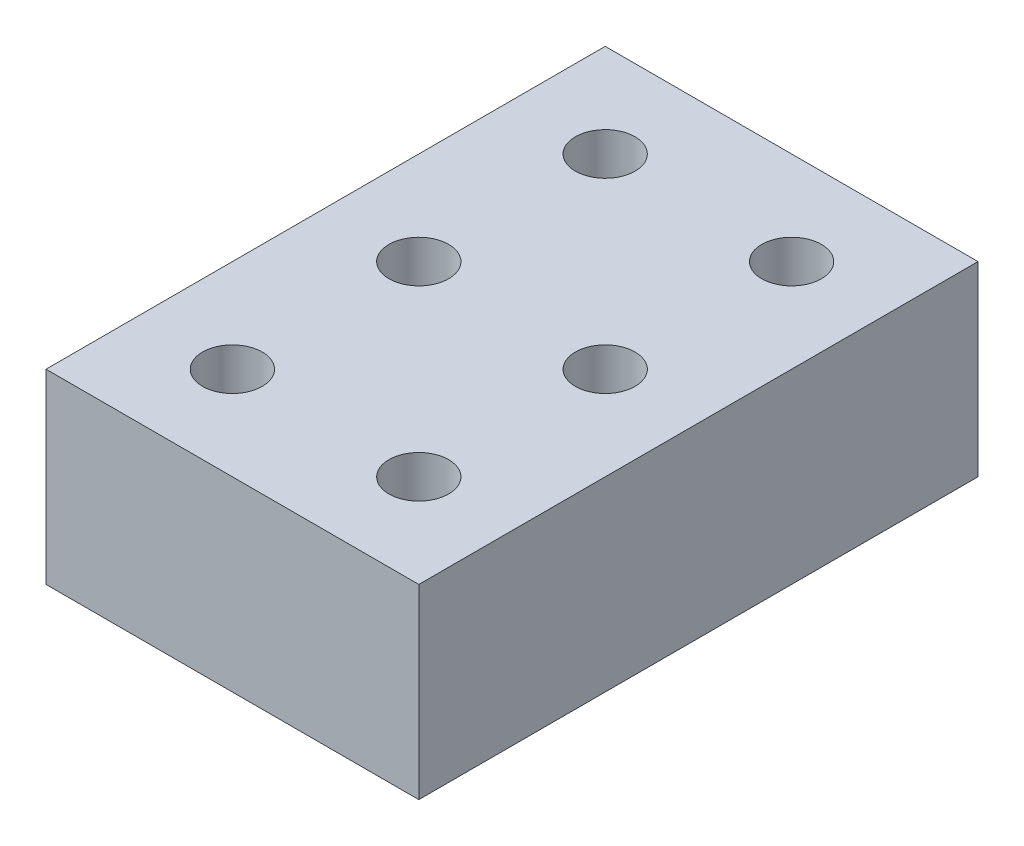
ISO-10303-21;
HEADER;
FILE_DESCRIPTION(('STEP AP214'),'2;1');
FILE_NAME('part.step','',(''),(''),'','','');
FILE_SCHEMA(('AUTOMOTIVE_DESIGN { 1 0 10303 214 1 1 1 1 }'));
ENDSEC;
DATA;
#1=APPLICATION_CONTEXT('core data for automotive mechanical design processes');
#2=APPLICATION_PROTOCOL_DEFINITION('international standard','automotive_design',2000,#1);
#3=PRODUCT_CONTEXT('',#1,'mechanical');
#4=PRODUCT('Part','Part','',(#3));
#5=PRODUCT_RELATED_PRODUCT_CATEGORY('part','',(#4));
#6=PRODUCT_DEFINITION_FORMATION('','',#4);
#7=PRODUCT_DEFINITION_CONTEXT('part definition',#1,'design');
#8=PRODUCT_DEFINITION('design','',#6,#7);
#9=PRODUCT_DEFINITION_SHAPE('','',#8);
#10=(LENGTH_UNIT() NAMED_UNIT(*) SI_UNIT(.MILLI.,.METRE.));
#11=(NAMED_UNIT(*) PLANE_ANGLE_UNIT() SI_UNIT($,.RADIAN.));
#12=(NAMED_UNIT(*) SI_UNIT($,.STERADIAN.) SOLID_ANGLE_UNIT());
#13=UNCERTAINTY_MEASURE_WITH_UNIT(LENGTH_MEASURE(1.E-05),#10,'distance_accuracy_value','');
#14=(GEOMETRIC_REPRESENTATION_CONTEXT(3) GLOBAL_UNCERTAINTY_ASSIGNED_CONTEXT((#13)) GLOBAL_UNIT_ASSIGNED_CONTEXT((#10,
#11,#12)) REPRESENTATION_CONTEXT('',''));
#15=CARTESIAN_POINT('',(0.,0.,0.));
#16=DIRECTION('',(0.,0.,1.));
#17=DIRECTION('',(1.,0.,0.));
#18=AXIS2_PLACEMENT_3D('',#15,#16,#17);
#19=CARTESIAN_POINT('',(0.,10.,0.));
#20=DIRECTION('',(0.,-1.,0.));
#21=DIRECTION('',(0.,0.,-1.));
#22=AXIS2_PLACEMENT_3D('',#19,#20,#21);
#23=PLANE('',#22);
#24=DIRECTION('',(0.,0.,-1.));
#25=VECTOR('',#24,1.);
#26=CARTESIAN_POINT('',(9.99999999999999,10.,15.));
#27=LINE('',#26,#25);
#28=CARTESIAN_POINT('',(9.99999999999999,10.,15.));
#29=VERTEX_POINT('',#28);
#30=CARTESIAN_POINT('',(10.,10.,-15.));
#31=VERTEX_POINT('',#30);
#32=EDGE_CURVE('E99',#29,#31,#27,.T.);
#33=ORIENTED_EDGE('',*,*,#32,.T.);
#34=DIRECTION('',(-1.,0.,0.));
#35=VECTOR('',#34,1.);
#36=CARTESIAN_POINT('',(-9.99999999999999,10.,-15.));
#37=LINE('',#36,#35);
#38=CARTESIAN_POINT('',(-9.99999999999999,10.,-15.));
#39=VERTEX_POINT('',#38);
#40=EDGE_CURVE('E94',#31,#39,#37,.T.);
#41=ORIENTED_EDGE('',*,*,#40,.T.);
#42=DIRECTION('',(0.,0.,1.));
#43=VECTOR('',#42,1.);
#44=CARTESIAN_POINT('',(-9.99999999999998,10.,15.));
#45=LINE('',#44,#43);
#46=CARTESIAN_POINT('',(-9.99999999999998,10.,15.));
#47=VERTEX_POINT('',#46);
#48=EDGE_CURVE('E97',#39,#47,#45,.T.);
#49=ORIENTED_EDGE('',*,*,#48,.T.);
#50=DIRECTION('',(1.,0.,0.));
#51=VECTOR('',#50,1.);
#52=CARTESIAN_POINT('',(-9.99999999999998,10.,15.));
#53=LINE('',#52,#51);
#54=EDGE_CURVE('E64',#47,#29,#53,.T.);
#55=ORIENTED_EDGE('',*,*,#54,.T.);
#56=EDGE_LOOP('',(#33,#41,#49,#55));
#57=FACE_BOUND('',#56,.T.);
#58=CARTESIAN_POINT('',(-5.,10.,0.));
#59=DIRECTION('',(0.,1.,0.));
#60=DIRECTION('',(0.,0.,1.));
#61=AXIS2_PLACEMENT_3D('',#58,#59,#60);
#62=CIRCLE('',#61,1.6);
#63=CARTESIAN_POINT('',(-5.,10.,1.6));
#64=VERTEX_POINT('',#63);
#65=EDGE_CURVE('E119',#64,#64,#62,.T.);
#66=ORIENTED_EDGE('',*,*,#65,.F.);
#67=EDGE_LOOP('',(#66));
#68=FACE_BOUND('',#67,.T.);
#69=CARTESIAN_POINT('',(-5.,10.,-10.));
#70=DIRECTION('',(0.,1.,0.));
#71=DIRECTION('',(0.,0.,1.));
#72=AXIS2_PLACEMENT_3D('',#69,#70,#71);
#73=CIRCLE('',#72,1.6);
#74=CARTESIAN_POINT('',(-5.,10.,-8.4));
#75=VERTEX_POINT('',#74);
#76=EDGE_CURVE('E141',#75,#75,#73,.T.);
#77=ORIENTED_EDGE('',*,*,#76,.F.);
#78=EDGE_LOOP('',(#77));
#79=FACE_BOUND('',#78,.T.);
#80=CARTESIAN_POINT('',(-5.,10.,10.));
#81=DIRECTION('',(0.,1.,0.));
#82=DIRECTION('',(0.,0.,1.));
#83=AXIS2_PLACEMENT_3D('',#80,#81,#82);
#84=CIRCLE('',#83,1.6);
#85=CARTESIAN_POINT('',(-5.,10.,11.6));
#86=VERTEX_POINT('',#85);
#87=EDGE_CURVE('E149',#86,#86,#84,.T.);
#88=ORIENTED_EDGE('',*,*,#87,.F.);
#89=EDGE_LOOP('',(#88));
#90=FACE_BOUND('',#89,.T.);
#91=CARTESIAN_POINT('',(5.,10.,9.99999999999999));
#92=DIRECTION('',(0.,1.,0.));
#93=DIRECTION('',(0.,0.,-1.));
#94=AXIS2_PLACEMENT_3D('',#91,#92,#93);
#95=CIRCLE('',#94,1.6);
#96=CARTESIAN_POINT('',(5.,10.,8.39999999999999));
#97=VERTEX_POINT('',#96);
#98=EDGE_CURVE('E157',#97,#97,#95,.T.);
#99=ORIENTED_EDGE('',*,*,#98,.F.);
#100=EDGE_LOOP('',(#99));
#101=FACE_BOUND('',#100,.T.);
#102=CARTESIAN_POINT('',(5.,10.,0.));
#103=DIRECTION('',(0.,1.,0.));
#104=DIRECTION('',(0.,0.,-1.));
#105=AXIS2_PLACEMENT_3D('',#102,#103,#104);
#106=CIRCLE('',#105,1.6);
#107=CARTESIAN_POINT('',(5.,10.,-1.60000000000001));
#108=VERTEX_POINT('',#107);
#109=EDGE_CURVE('E165',#108,#108,#106,.T.);
#110=ORIENTED_EDGE('',*,*,#109,.F.);
#111=EDGE_LOOP('',(#110));
#112=FACE_BOUND('',#111,.T.);
#113=CARTESIAN_POINT('',(5.,10.,-10.));
#114=DIRECTION('',(0.,1.,0.));
#115=DIRECTION('',(0.,0.,-1.));
#116=AXIS2_PLACEMENT_3D('',#113,#114,#115);
#117=CIRCLE('',#116,1.6);
#118=CARTESIAN_POINT('',(5.,10.,-11.6));
#119=VERTEX_POINT('',#118);
#120=EDGE_CURVE('E173',#119,#119,#117,.T.);
#121=ORIENTED_EDGE('',*,*,#120,.F.);
#122=EDGE_LOOP('',(#121));
#123=FACE_BOUND('',#122,.T.);
#124=ADVANCED_FACE('F46',(#57,#68,#79,#90,#101,#112,#123),#23,.F.);
#125=CARTESIAN_POINT('',(0.,0.,0.));
#126=DIRECTION('',(0.,-1.,0.));
#127=DIRECTION('',(0.,0.,-1.));
#128=AXIS2_PLACEMENT_3D('',#125,#126,#127);
#129=PLANE('',#128);
#130=CARTESIAN_POINT('',(5.,0.,0.));
#131=DIRECTION('',(0.,1.,0.));
#132=DIRECTION('',(0.,0.,-1.));
#133=AXIS2_PLACEMENT_3D('',#130,#131,#132);
#134=CIRCLE('',#133,1.6);
#135=CARTESIAN_POINT('',(5.,0.,-1.60000000000001));
#136=VERTEX_POINT('',#135);
#137=EDGE_CURVE('E169',#136,#136,#134,.T.);
#138=ORIENTED_EDGE('',*,*,#137,.T.);
#139=EDGE_LOOP('',(#138));
#140=FACE_BOUND('',#139,.T.);
#141=CARTESIAN_POINT('',(-5.,0.,10.));
#142=DIRECTION('',(0.,1.,0.));
#143=DIRECTION('',(0.,0.,1.));
#144=AXIS2_PLACEMENT_3D('',#141,#142,#143);
#145=CIRCLE('',#144,1.6);
#146=CARTESIAN_POINT('',(-5.,0.,11.6));
#147=VERTEX_POINT('',#146);
#148=EDGE_CURVE('E153',#147,#147,#145,.T.);
#149=ORIENTED_EDGE('',*,*,#148,.T.);
#150=EDGE_LOOP('',(#149));
#151=FACE_BOUND('',#150,.T.);
#152=CARTESIAN_POINT('',(-5.,0.,0.));
#153=DIRECTION('',(0.,1.,0.));
#154=DIRECTION('',(0.,0.,1.));
#155=AXIS2_PLACEMENT_3D('',#152,#153,#154);
#156=CIRCLE('',#155,1.6);
#157=CARTESIAN_POINT('',(-5.,0.,1.6));
#158=VERTEX_POINT('',#157);
#159=EDGE_CURVE('E137',#158,#158,#156,.T.);
#160=ORIENTED_EDGE('',*,*,#159,.T.);
#161=EDGE_LOOP('',(#160));
#162=FACE_BOUND('',#161,.T.);
#163=DIRECTION('',(0.,0.,-1.));
#164=VECTOR('',#163,1.);
#165=CARTESIAN_POINT('',(9.99999999999999,0.,15.));
#166=LINE('',#165,#164);
#167=CARTESIAN_POINT('',(9.99999999999999,0.,15.));
#168=VERTEX_POINT('',#167);
#169=CARTESIAN_POINT('',(10.,0.,-15.));
#170=VERTEX_POINT('',#169);
#171=EDGE_CURVE('E115',#168,#170,#166,.T.);
#172=ORIENTED_EDGE('',*,*,#171,.F.);
#173=DIRECTION('',(1.,0.,0.));
#174=VECTOR('',#173,1.);
#175=CARTESIAN_POINT('',(-9.99999999999998,0.,15.));
#176=LINE('',#175,#174);
#177=CARTESIAN_POINT('',(-9.99999999999998,0.,15.));
#178=VERTEX_POINT('',#177);
#179=EDGE_CURVE('E87',#178,#168,#176,.T.);
#180=ORIENTED_EDGE('',*,*,#179,.F.);
#181=DIRECTION('',(0.,0.,1.));
#182=VECTOR('',#181,1.);
#183=CARTESIAN_POINT('',(-9.99999999999998,0.,15.));
#184=LINE('',#183,#182);
#185=CARTESIAN_POINT('',(-9.99999999999999,0.,-15.));
#186=VERTEX_POINT('',#185);
#187=EDGE_CURVE('E81',#186,#178,#184,.T.);
#188=ORIENTED_EDGE('',*,*,#187,.F.);
#189=DIRECTION('',(-1.,0.,0.));
#190=VECTOR('',#189,1.);
#191=CARTESIAN_POINT('',(-9.99999999999999,0.,-15.));
#192=LINE('',#191,#190);
#193=EDGE_CURVE('E104',#170,#186,#192,.T.);
#194=ORIENTED_EDGE('',*,*,#193,.F.);
#195=EDGE_LOOP('',(#172,#180,#188,#194));
#196=FACE_BOUND('',#195,.T.);
#197=CARTESIAN_POINT('',(-5.,0.,-10.));
#198=DIRECTION('',(0.,1.,0.));
#199=DIRECTION('',(0.,0.,1.));
#200=AXIS2_PLACEMENT_3D('',#197,#198,#199);
#201=CIRCLE('',#200,1.6);
#202=CARTESIAN_POINT('',(-5.,0.,-8.4));
#203=VERTEX_POINT('',#202);
#204=EDGE_CURVE('E145',#203,#203,#201,.T.);
#205=ORIENTED_EDGE('',*,*,#204,.T.);
#206=EDGE_LOOP('',(#205));
#207=FACE_BOUND('',#206,.T.);
#208=CARTESIAN_POINT('',(5.,0.,9.99999999999999));
#209=DIRECTION('',(0.,1.,0.));
#210=DIRECTION('',(0.,0.,-1.));
#211=AXIS2_PLACEMENT_3D('',#208,#209,#210);
#212=CIRCLE('',#211,1.6);
#213=CARTESIAN_POINT('',(5.,0.,8.39999999999999));
#214=VERTEX_POINT('',#213);
#215=EDGE_CURVE('E161',#214,#214,#212,.T.);
#216=ORIENTED_EDGE('',*,*,#215,.T.);
#217=EDGE_LOOP('',(#216));
#218=FACE_BOUND('',#217,.T.);
#219=CARTESIAN_POINT('',(5.,0.,-10.));
#220=DIRECTION('',(0.,1.,0.));
#221=DIRECTION('',(0.,0.,-1.));
#222=AXIS2_PLACEMENT_3D('',#219,#220,#221);
#223=CIRCLE('',#222,1.6);
#224=CARTESIAN_POINT('',(5.,0.,-11.6));
#225=VERTEX_POINT('',#224);
#226=EDGE_CURVE('E177',#225,#225,#223,.T.);
#227=ORIENTED_EDGE('',*,*,#226,.T.);
#228=EDGE_LOOP('',(#227));
#229=FACE_BOUND('',#228,.T.);
#230=ADVANCED_FACE('F132',(#140,#151,#162,#196,#207,#218,#229),#129,.T.);
#231=CARTESIAN_POINT('',(9.99999999999999,10.,15.));
#232=DIRECTION('',(-1.,0.,0.));
#233=DIRECTION('',(0.,0.,1.));
#234=AXIS2_PLACEMENT_3D('',#231,#232,#233);
#235=PLANE('',#234);
#236=ORIENTED_EDGE('',*,*,#171,.T.);
#237=DIRECTION('',(0.,-1.,0.));
#238=VECTOR('',#237,1.);
#239=CARTESIAN_POINT('',(10.,10.,-15.));
#240=LINE('',#239,#238);
#241=EDGE_CURVE('E11',#31,#170,#240,.T.);
#242=ORIENTED_EDGE('',*,*,#241,.F.);
#243=ORIENTED_EDGE('',*,*,#32,.F.);
#244=DIRECTION('',(0.,-1.,0.));
#245=VECTOR('',#244,1.);
#246=CARTESIAN_POINT('',(9.99999999999999,10.,15.));
#247=LINE('',#246,#245);
#248=EDGE_CURVE('E111',#29,#168,#247,.T.);
#249=ORIENTED_EDGE('',*,*,#248,.T.);
#250=EDGE_LOOP('',(#236,#242,#243,#249));
#251=FACE_BOUND('',#250,.T.);
#252=ADVANCED_FACE('F48',(#251),#235,.F.);
#253=CARTESIAN_POINT('',(-9.99999999999999,10.,-15.));
#254=DIRECTION('',(0.,0.,1.));
#255=DIRECTION('',(1.,0.,0.));
#256=AXIS2_PLACEMENT_3D('',#253,#254,#255);
#257=PLANE('',#256);
#258=ORIENTED_EDGE('',*,*,#193,.T.);
#259=DIRECTION('',(0.,-1.,0.));
#260=VECTOR('',#259,1.);
#261=CARTESIAN_POINT('',(-9.99999999999999,10.,-15.));
#262=LINE('',#261,#260);
#263=EDGE_CURVE('E56',#39,#186,#262,.T.);
#264=ORIENTED_EDGE('',*,*,#263,.F.);
#265=ORIENTED_EDGE('',*,*,#40,.F.);
#266=ORIENTED_EDGE('',*,*,#241,.T.);
#267=EDGE_LOOP('',(#258,#264,#265,#266));
#268=FACE_BOUND('',#267,.T.);
#269=ADVANCED_FACE('F103',(#268),#257,.F.);
#270=CARTESIAN_POINT('',(-9.99999999999998,10.,15.));
#271=DIRECTION('',(1.,0.,0.));
#272=DIRECTION('',(0.,0.,-1.));
#273=AXIS2_PLACEMENT_3D('',#270,#271,#272);
#274=PLANE('',#273);
#275=ORIENTED_EDGE('',*,*,#187,.T.);
#276=DIRECTION('',(0.,-1.,0.));
#277=VECTOR('',#276,1.);
#278=CARTESIAN_POINT('',(-9.99999999999998,10.,15.));
#279=LINE('',#278,#277);
#280=EDGE_CURVE('E106',#47,#178,#279,.T.);
#281=ORIENTED_EDGE('',*,*,#280,.F.);
#282=ORIENTED_EDGE('',*,*,#48,.F.);
#283=ORIENTED_EDGE('',*,*,#263,.T.);
#284=EDGE_LOOP('',(#275,#281,#282,#283));
#285=FACE_BOUND('',#284,.T.);
#286=ADVANCED_FACE('F107',(#285),#274,.F.);
#287=CARTESIAN_POINT('',(-9.99999999999998,10.,15.));
#288=DIRECTION('',(0.,0.,-1.));
#289=DIRECTION('',(-1.,0.,0.));
#290=AXIS2_PLACEMENT_3D('',#287,#288,#289);
#291=PLANE('',#290);
#292=ORIENTED_EDGE('',*,*,#179,.T.);
#293=ORIENTED_EDGE('',*,*,#248,.F.);
#294=ORIENTED_EDGE('',*,*,#54,.F.);
#295=ORIENTED_EDGE('',*,*,#280,.T.);
#296=EDGE_LOOP('',(#292,#293,#294,#295));
#297=FACE_BOUND('',#296,.T.);
#298=ADVANCED_FACE('F129',(#297),#291,.F.);
#299=CARTESIAN_POINT('',(-5.,10.,0.));
#300=DIRECTION('',(0.,-1.,0.));
#301=DIRECTION('',(0.,0.,-1.));
#302=AXIS2_PLACEMENT_3D('',#299,#300,#301);
#303=CYLINDRICAL_SURFACE('',#302,1.6);
#304=ORIENTED_EDGE('',*,*,#65,.T.);
#305=EDGE_LOOP('',(#304));
#306=FACE_BOUND('',#305,.T.);
#307=ORIENTED_EDGE('',*,*,#159,.F.);
#308=EDGE_LOOP('',(#307));
#309=FACE_BOUND('',#308,.T.);
#310=ADVANCED_FACE('F196',(#306,#309),#303,.F.);
#311=CARTESIAN_POINT('',(-5.,10.,-10.));
#312=DIRECTION('',(0.,-1.,0.));
#313=DIRECTION('',(0.,0.,-1.));
#314=AXIS2_PLACEMENT_3D('',#311,#312,#313);
#315=CYLINDRICAL_SURFACE('',#314,1.6);
#316=ORIENTED_EDGE('',*,*,#76,.T.);
#317=EDGE_LOOP('',(#316));
#318=FACE_BOUND('',#317,.T.);
#319=ORIENTED_EDGE('',*,*,#204,.F.);
#320=EDGE_LOOP('',(#319));
#321=FACE_BOUND('',#320,.T.);
#322=ADVANCED_FACE('F250',(#318,#321),#315,.F.);
#323=CARTESIAN_POINT('',(-5.,10.,10.));
#324=DIRECTION('',(0.,-1.,0.));
#325=DIRECTION('',(0.,0.,-1.));
#326=AXIS2_PLACEMENT_3D('',#323,#324,#325);
#327=CYLINDRICAL_SURFACE('',#326,1.6);
#328=ORIENTED_EDGE('',*,*,#87,.T.);
#329=EDGE_LOOP('',(#328));
#330=FACE_BOUND('',#329,.T.);
#331=ORIENTED_EDGE('',*,*,#148,.F.);
#332=EDGE_LOOP('',(#331));
#333=FACE_BOUND('',#332,.T.);
#334=ADVANCED_FACE('F259',(#330,#333),#327,.F.);
#335=CARTESIAN_POINT('',(5.,10.,9.99999999999999));
#336=DIRECTION('',(0.,-1.,0.));
#337=DIRECTION('',(0.,0.,-1.));
#338=AXIS2_PLACEMENT_3D('',#335,#336,#337);
#339=CYLINDRICAL_SURFACE('',#338,1.6);
#340=ORIENTED_EDGE('',*,*,#98,.T.);
#341=EDGE_LOOP('',(#340));
#342=FACE_BOUND('',#341,.T.);
#343=ORIENTED_EDGE('',*,*,#215,.F.);
#344=EDGE_LOOP('',(#343));
#345=FACE_BOUND('',#344,.T.);
#346=ADVANCED_FACE('F268',(#342,#345),#339,.F.);
#347=CARTESIAN_POINT('',(5.,10.,0.));
#348=DIRECTION('',(0.,-1.,0.));
#349=DIRECTION('',(0.,0.,-1.));
#350=AXIS2_PLACEMENT_3D('',#347,#348,#349);
#351=CYLINDRICAL_SURFACE('',#350,1.6);
#352=ORIENTED_EDGE('',*,*,#109,.T.);
#353=EDGE_LOOP('',(#352));
#354=FACE_BOUND('',#353,.T.);
#355=ORIENTED_EDGE('',*,*,#137,.F.);
#356=EDGE_LOOP('',(#355));
#357=FACE_BOUND('',#356,.T.);
#358=ADVANCED_FACE('F278',(#354,#357),#351,.F.);
#359=CARTESIAN_POINT('',(5.,10.,-10.));
#360=DIRECTION('',(0.,-1.,0.));
#361=DIRECTION('',(0.,0.,-1.));
#362=AXIS2_PLACEMENT_3D('',#359,#360,#361);
#363=CYLINDRICAL_SURFACE('',#362,1.6);
#364=ORIENTED_EDGE('',*,*,#120,.T.);
#365=EDGE_LOOP('',(#364));
#366=FACE_BOUND('',#365,.T.);
#367=ORIENTED_EDGE('',*,*,#226,.F.);
#368=EDGE_LOOP('',(#367));
#369=FACE_BOUND('',#368,.T.);
#370=ADVANCED_FACE('F185',(#366,#369),#363,.F.);
#371=CLOSED_SHELL('',(#124,#230,#252,#269,#286,#298,#310,#322,#334,#346,#358,#370));
#372=MANIFOLD_SOLID_BREP('B2',#371);
#373=ADVANCED_BREP_SHAPE_REPRESENTATION('',(#18,#372),#14);
#374=SHAPE_DEFINITION_REPRESENTATION(#9,#373);
ENDSEC;
END-ISO-10303-21;
